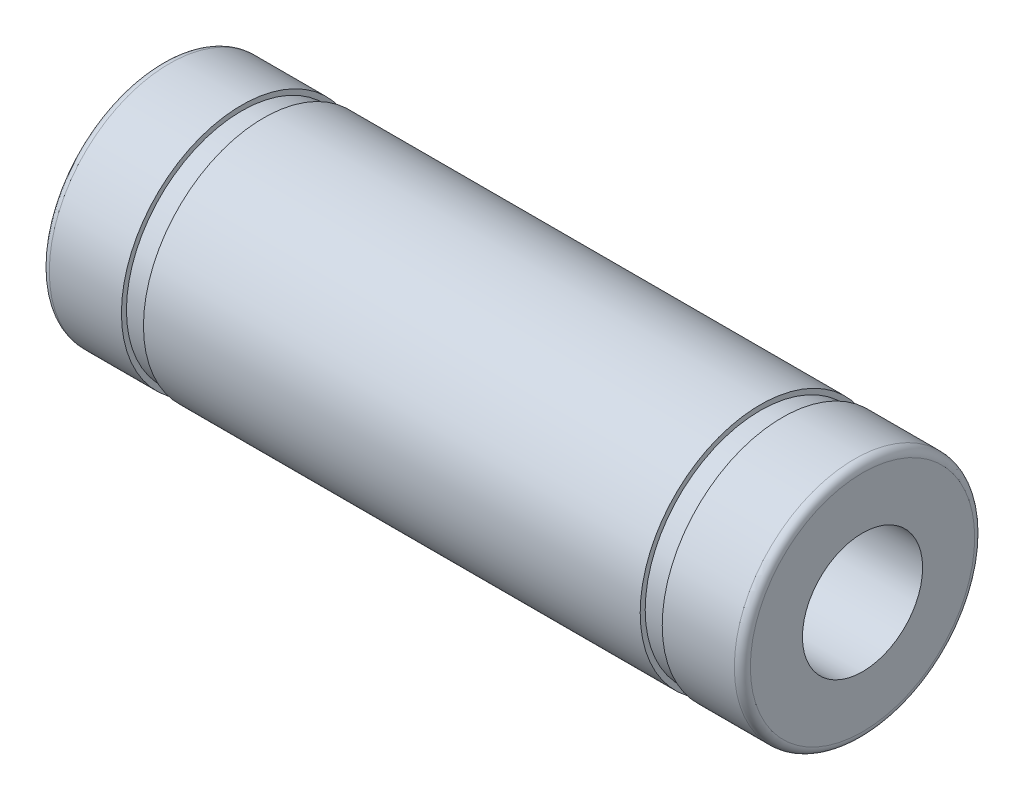
ISO-10303-21;
HEADER;
FILE_DESCRIPTION(('STEP AP214'),'2;1');
FILE_NAME('part.step','',(''),(''),'','','');
FILE_SCHEMA(('AUTOMOTIVE_DESIGN { 1 0 10303 214 1 1 1 1 }'));
ENDSEC;
DATA;
#1=APPLICATION_CONTEXT('core data for automotive mechanical design processes');
#2=APPLICATION_PROTOCOL_DEFINITION('international standard','automotive_design',2000,#1);
#3=PRODUCT_CONTEXT('',#1,'mechanical');
#4=PRODUCT('Part','Part','',(#3));
#5=PRODUCT_RELATED_PRODUCT_CATEGORY('part','',(#4));
#6=PRODUCT_DEFINITION_FORMATION('','',#4);
#7=PRODUCT_DEFINITION_CONTEXT('part definition',#1,'design');
#8=PRODUCT_DEFINITION('design','',#6,#7);
#9=PRODUCT_DEFINITION_SHAPE('','',#8);
#10=(LENGTH_UNIT() NAMED_UNIT(*) SI_UNIT(.MILLI.,.METRE.));
#11=(NAMED_UNIT(*) PLANE_ANGLE_UNIT() SI_UNIT($,.RADIAN.));
#12=(NAMED_UNIT(*) SI_UNIT($,.STERADIAN.) SOLID_ANGLE_UNIT());
#13=UNCERTAINTY_MEASURE_WITH_UNIT(LENGTH_MEASURE(1.E-05),#10,'distance_accuracy_value','');
#14=(GEOMETRIC_REPRESENTATION_CONTEXT(3) GLOBAL_UNCERTAINTY_ASSIGNED_CONTEXT((#13)) GLOBAL_UNIT_ASSIGNED_CONTEXT((#10,
#11,#12)) REPRESENTATION_CONTEXT('',''));
#15=CARTESIAN_POINT('',(0.,0.,0.));
#16=DIRECTION('',(0.,0.,1.));
#17=DIRECTION('',(1.,0.,0.));
#18=AXIS2_PLACEMENT_3D('',#15,#16,#17);
#19=CARTESIAN_POINT('',(0.,-5.6,-5.6));
#20=DIRECTION('',(-1.,0.,0.));
#21=DIRECTION('',(0.,0.,1.));
#22=AXIS2_PLACEMENT_3D('',#19,#20,#21);
#23=PLANE('',#22);
#24=CARTESIAN_POINT('',(0.,0.,0.));
#25=DIRECTION('',(-1.,0.,0.));
#26=DIRECTION('',(0.,0.,-1.));
#27=AXIS2_PLACEMENT_3D('',#24,#25,#26);
#28=CIRCLE('',#27,5.6);
#29=CARTESIAN_POINT('',(0.,0.,-5.6));
#30=VERTEX_POINT('',#29);
#31=EDGE_CURVE('E61',#30,#30,#28,.F.);
#32=ORIENTED_EDGE('',*,*,#31,.F.);
#33=EDGE_LOOP('',(#32));
#34=FACE_BOUND('',#33,.T.);
#35=CARTESIAN_POINT('',(0.,0.,0.));
#36=DIRECTION('',(1.,0.,0.));
#37=DIRECTION('',(0.,0.,1.));
#38=AXIS2_PLACEMENT_3D('',#35,#36,#37);
#39=CIRCLE('',#38,3.);
#40=CARTESIAN_POINT('',(0.,0.,3.));
#41=VERTEX_POINT('',#40);
#42=EDGE_CURVE('E58',#41,#41,#39,.T.);
#43=ORIENTED_EDGE('',*,*,#42,.T.);
#44=EDGE_LOOP('',(#43));
#45=FACE_BOUND('',#44,.T.);
#46=ADVANCED_FACE('F14',(#34,#45),#23,.T.);
#47=CARTESIAN_POINT('',(35.,-5.6,5.6));
#48=DIRECTION('',(1.,0.,0.));
#49=DIRECTION('',(0.,0.,-1.));
#50=AXIS2_PLACEMENT_3D('',#47,#48,#49);
#51=PLANE('',#50);
#52=CARTESIAN_POINT('',(35.,0.,0.));
#53=DIRECTION('',(1.,0.,0.));
#54=DIRECTION('',(0.,0.,1.));
#55=AXIS2_PLACEMENT_3D('',#52,#53,#54);
#56=CIRCLE('',#55,5.6);
#57=CARTESIAN_POINT('',(35.,0.,5.6));
#58=VERTEX_POINT('',#57);
#59=EDGE_CURVE('E55',#58,#58,#56,.T.);
#60=ORIENTED_EDGE('',*,*,#59,.T.);
#61=EDGE_LOOP('',(#60));
#62=FACE_BOUND('',#61,.T.);
#63=CARTESIAN_POINT('',(35.,0.,0.));
#64=DIRECTION('',(-1.,0.,0.));
#65=DIRECTION('',(0.,0.,-1.));
#66=AXIS2_PLACEMENT_3D('',#63,#64,#65);
#67=CIRCLE('',#66,3.);
#68=CARTESIAN_POINT('',(35.,0.,-3.));
#69=VERTEX_POINT('',#68);
#70=EDGE_CURVE('E52',#69,#69,#67,.F.);
#71=ORIENTED_EDGE('',*,*,#70,.F.);
#72=EDGE_LOOP('',(#71));
#73=FACE_BOUND('',#72,.T.);
#74=ADVANCED_FACE('F69',(#62,#73),#51,.T.);
#75=CARTESIAN_POINT('',(31.,-6.16394374595285,-6.));
#76=DIRECTION('',(-1.,0.,0.));
#77=DIRECTION('',(0.,0.,1.));
#78=AXIS2_PLACEMENT_3D('',#75,#76,#77);
#79=PLANE('',#78);
#80=CARTESIAN_POINT('',(31.,0.,0.));
#81=DIRECTION('',(-1.,0.,0.));
#82=DIRECTION('',(0.,0.,-1.));
#83=AXIS2_PLACEMENT_3D('',#80,#81,#82);
#84=CIRCLE('',#83,6.);
#85=CARTESIAN_POINT('',(31.,0.,-6.));
#86=VERTEX_POINT('',#85);
#87=EDGE_CURVE('E49',#86,#86,#84,.F.);
#88=ORIENTED_EDGE('',*,*,#87,.F.);
#89=EDGE_LOOP('',(#88));
#90=FACE_BOUND('',#89,.T.);
#91=CARTESIAN_POINT('',(31.,0.,0.));
#92=DIRECTION('',(1.,0.,0.));
#93=DIRECTION('',(0.,0.,1.));
#94=AXIS2_PLACEMENT_3D('',#91,#92,#93);
#95=CIRCLE('',#94,5.75);
#96=CARTESIAN_POINT('',(31.,0.,5.75));
#97=VERTEX_POINT('',#96);
#98=EDGE_CURVE('E46',#97,#97,#95,.T.);
#99=ORIENTED_EDGE('',*,*,#98,.T.);
#100=EDGE_LOOP('',(#99));
#101=FACE_BOUND('',#100,.T.);
#102=ADVANCED_FACE('F123',(#90,#101),#79,.T.);
#103=CARTESIAN_POINT('',(29.9,-6.16394374595285,6.));
#104=DIRECTION('',(1.,0.,0.));
#105=DIRECTION('',(0.,0.,-1.));
#106=AXIS2_PLACEMENT_3D('',#103,#104,#105);
#107=PLANE('',#106);
#108=CARTESIAN_POINT('',(29.9,0.,0.));
#109=DIRECTION('',(1.,0.,0.));
#110=DIRECTION('',(0.,0.,1.));
#111=AXIS2_PLACEMENT_3D('',#108,#109,#110);
#112=CIRCLE('',#111,6.);
#113=CARTESIAN_POINT('',(29.9,0.,6.));
#114=VERTEX_POINT('',#113);
#115=EDGE_CURVE('E43',#114,#114,#112,.T.);
#116=ORIENTED_EDGE('',*,*,#115,.T.);
#117=EDGE_LOOP('',(#116));
#118=FACE_BOUND('',#117,.T.);
#119=CARTESIAN_POINT('',(29.9,0.,0.));
#120=DIRECTION('',(-1.,0.,0.));
#121=DIRECTION('',(0.,0.,-1.));
#122=AXIS2_PLACEMENT_3D('',#119,#120,#121);
#123=CIRCLE('',#122,5.75);
#124=CARTESIAN_POINT('',(29.9,0.,-5.75));
#125=VERTEX_POINT('',#124);
#126=EDGE_CURVE('E40',#125,#125,#123,.F.);
#127=ORIENTED_EDGE('',*,*,#126,.F.);
#128=EDGE_LOOP('',(#127));
#129=FACE_BOUND('',#128,.T.);
#130=ADVANCED_FACE('F118',(#118,#129),#107,.T.);
#131=CARTESIAN_POINT('',(5.1,-6.16394374595285,-6.));
#132=DIRECTION('',(-1.,0.,0.));
#133=DIRECTION('',(0.,0.,1.));
#134=AXIS2_PLACEMENT_3D('',#131,#132,#133);
#135=PLANE('',#134);
#136=CARTESIAN_POINT('',(5.1,0.,0.));
#137=DIRECTION('',(-1.,0.,0.));
#138=DIRECTION('',(0.,0.,-1.));
#139=AXIS2_PLACEMENT_3D('',#136,#137,#138);
#140=CIRCLE('',#139,6.);
#141=CARTESIAN_POINT('',(5.1,0.,-6.));
#142=VERTEX_POINT('',#141);
#143=EDGE_CURVE('E37',#142,#142,#140,.F.);
#144=ORIENTED_EDGE('',*,*,#143,.F.);
#145=EDGE_LOOP('',(#144));
#146=FACE_BOUND('',#145,.T.);
#147=CARTESIAN_POINT('',(5.1,0.,0.));
#148=DIRECTION('',(1.,0.,0.));
#149=DIRECTION('',(0.,0.,1.));
#150=AXIS2_PLACEMENT_3D('',#147,#148,#149);
#151=CIRCLE('',#150,5.75);
#152=CARTESIAN_POINT('',(5.1,0.,5.75));
#153=VERTEX_POINT('',#152);
#154=EDGE_CURVE('E34',#153,#153,#151,.T.);
#155=ORIENTED_EDGE('',*,*,#154,.T.);
#156=EDGE_LOOP('',(#155));
#157=FACE_BOUND('',#156,.T.);
#158=ADVANCED_FACE('F86',(#146,#157),#135,.T.);
#159=CARTESIAN_POINT('',(4.,-6.16394374595285,6.));
#160=DIRECTION('',(1.,0.,0.));
#161=DIRECTION('',(0.,0.,-1.));
#162=AXIS2_PLACEMENT_3D('',#159,#160,#161);
#163=PLANE('',#162);
#164=CARTESIAN_POINT('',(4.,0.,0.));
#165=DIRECTION('',(1.,0.,0.));
#166=DIRECTION('',(0.,0.,1.));
#167=AXIS2_PLACEMENT_3D('',#164,#165,#166);
#168=CIRCLE('',#167,6.);
#169=CARTESIAN_POINT('',(4.,0.,6.));
#170=VERTEX_POINT('',#169);
#171=EDGE_CURVE('E29',#170,#170,#168,.T.);
#172=ORIENTED_EDGE('',*,*,#171,.T.);
#173=EDGE_LOOP('',(#172));
#174=FACE_BOUND('',#173,.T.);
#175=CARTESIAN_POINT('',(4.,0.,0.));
#176=DIRECTION('',(-1.,0.,0.));
#177=DIRECTION('',(0.,0.,-1.));
#178=AXIS2_PLACEMENT_3D('',#175,#176,#177);
#179=CIRCLE('',#178,5.75);
#180=CARTESIAN_POINT('',(4.,0.,-5.75));
#181=VERTEX_POINT('',#180);
#182=EDGE_CURVE('E25',#181,#181,#179,.F.);
#183=ORIENTED_EDGE('',*,*,#182,.F.);
#184=EDGE_LOOP('',(#183));
#185=FACE_BOUND('',#184,.T.);
#186=ADVANCED_FACE('F76',(#174,#185),#163,.T.);
#187=CARTESIAN_POINT('',(17.5,0.,0.));
#188=DIRECTION('',(1.,0.,0.));
#189=DIRECTION('',(0.,0.,1.));
#190=AXIS2_PLACEMENT_3D('',#187,#188,#189);
#191=CYLINDRICAL_SURFACE('',#190,3.);
#192=ORIENTED_EDGE('',*,*,#70,.T.);
#193=EDGE_LOOP('',(#192));
#194=FACE_BOUND('',#193,.T.);
#195=ORIENTED_EDGE('',*,*,#42,.F.);
#196=EDGE_LOOP('',(#195));
#197=FACE_BOUND('',#196,.T.);
#198=ADVANCED_FACE('F73',(#194,#197),#191,.F.);
#199=CARTESIAN_POINT('',(34.6000000000006,0.,0.));
#200=DIRECTION('',(1.,0.,0.));
#201=DIRECTION('',(0.,0.,1.));
#202=AXIS2_PLACEMENT_3D('',#199,#200,#201);
#203=TOROIDAL_SURFACE('',#202,5.60000000000061,0.399999999999387);
#204=CARTESIAN_POINT('',(34.6000000000006,0.,0.));
#205=DIRECTION('',(1.,0.,0.));
#206=DIRECTION('',(0.,0.,1.));
#207=AXIS2_PLACEMENT_3D('',#204,#205,#206);
#208=CIRCLE('',#207,6.);
#209=CARTESIAN_POINT('',(34.6000000000006,0.,6.));
#210=VERTEX_POINT('',#209);
#211=EDGE_CURVE('E21',#210,#210,#208,.T.);
#212=ORIENTED_EDGE('',*,*,#211,.T.);
#213=EDGE_LOOP('',(#212));
#214=FACE_BOUND('',#213,.T.);
#215=ORIENTED_EDGE('',*,*,#59,.F.);
#216=EDGE_LOOP('',(#215));
#217=FACE_BOUND('',#216,.T.);
#218=ADVANCED_FACE('F75',(#214,#217),#203,.T.);
#219=CARTESIAN_POINT('',(17.5,0.,0.));
#220=DIRECTION('',(1.,0.,0.));
#221=DIRECTION('',(0.,0.,1.));
#222=AXIS2_PLACEMENT_3D('',#219,#220,#221);
#223=CYLINDRICAL_SURFACE('',#222,6.);
#224=ORIENTED_EDGE('',*,*,#87,.T.);
#225=EDGE_LOOP('',(#224));
#226=FACE_BOUND('',#225,.T.);
#227=ORIENTED_EDGE('',*,*,#211,.F.);
#228=EDGE_LOOP('',(#227));
#229=FACE_BOUND('',#228,.T.);
#230=ADVANCED_FACE('F84',(#226,#229),#223,.T.);
#231=CARTESIAN_POINT('',(17.5,0.,0.));
#232=DIRECTION('',(1.,0.,0.));
#233=DIRECTION('',(0.,0.,1.));
#234=AXIS2_PLACEMENT_3D('',#231,#232,#233);
#235=CYLINDRICAL_SURFACE('',#234,5.75);
#236=ORIENTED_EDGE('',*,*,#126,.T.);
#237=EDGE_LOOP('',(#236));
#238=FACE_BOUND('',#237,.T.);
#239=ORIENTED_EDGE('',*,*,#98,.F.);
#240=EDGE_LOOP('',(#239));
#241=FACE_BOUND('',#240,.T.);
#242=ADVANCED_FACE('F93',(#238,#241),#235,.T.);
#243=CARTESIAN_POINT('',(17.5,0.,0.));
#244=DIRECTION('',(1.,0.,0.));
#245=DIRECTION('',(0.,0.,1.));
#246=AXIS2_PLACEMENT_3D('',#243,#244,#245);
#247=CYLINDRICAL_SURFACE('',#246,6.);
#248=ORIENTED_EDGE('',*,*,#143,.T.);
#249=EDGE_LOOP('',(#248));
#250=FACE_BOUND('',#249,.T.);
#251=ORIENTED_EDGE('',*,*,#115,.F.);
#252=EDGE_LOOP('',(#251));
#253=FACE_BOUND('',#252,.T.);
#254=ADVANCED_FACE('F97',(#250,#253),#247,.T.);
#255=CARTESIAN_POINT('',(17.5,0.,0.));
#256=DIRECTION('',(1.,0.,0.));
#257=DIRECTION('',(0.,0.,1.));
#258=AXIS2_PLACEMENT_3D('',#255,#256,#257);
#259=CYLINDRICAL_SURFACE('',#258,5.75);
#260=ORIENTED_EDGE('',*,*,#182,.T.);
#261=EDGE_LOOP('',(#260));
#262=FACE_BOUND('',#261,.T.);
#263=ORIENTED_EDGE('',*,*,#154,.F.);
#264=EDGE_LOOP('',(#263));
#265=FACE_BOUND('',#264,.T.);
#266=ADVANCED_FACE('F101',(#262,#265),#259,.T.);
#267=CARTESIAN_POINT('',(17.5,0.,0.));
#268=DIRECTION('',(1.,0.,0.));
#269=DIRECTION('',(0.,0.,1.));
#270=AXIS2_PLACEMENT_3D('',#267,#268,#269);
#271=CYLINDRICAL_SURFACE('',#270,6.);
#272=CARTESIAN_POINT('',(0.399999999999999,0.,0.));
#273=DIRECTION('',(1.,0.,0.));
#274=DIRECTION('',(0.,0.,1.));
#275=AXIS2_PLACEMENT_3D('',#272,#273,#274);
#276=CIRCLE('',#275,6.);
#277=CARTESIAN_POINT('',(0.399999999999999,0.,6.));
#278=VERTEX_POINT('',#277);
#279=EDGE_CURVE('E10',#278,#278,#276,.T.);
#280=ORIENTED_EDGE('',*,*,#279,.T.);
#281=EDGE_LOOP('',(#280));
#282=FACE_BOUND('',#281,.T.);
#283=ORIENTED_EDGE('',*,*,#171,.F.);
#284=EDGE_LOOP('',(#283));
#285=FACE_BOUND('',#284,.T.);
#286=ADVANCED_FACE('F104',(#282,#285),#271,.T.);
#287=CARTESIAN_POINT('',(0.40000000000003,0.,0.));
#288=DIRECTION('',(1.,0.,0.));
#289=DIRECTION('',(0.,0.,1.));
#290=AXIS2_PLACEMENT_3D('',#287,#288,#289);
#291=TOROIDAL_SURFACE('',#290,5.6,0.40000000000003);
#292=ORIENTED_EDGE('',*,*,#31,.T.);
#293=EDGE_LOOP('',(#292));
#294=FACE_BOUND('',#293,.T.);
#295=ORIENTED_EDGE('',*,*,#279,.F.);
#296=EDGE_LOOP('',(#295));
#297=FACE_BOUND('',#296,.T.);
#298=ADVANCED_FACE('F16',(#294,#297),#291,.T.);
#299=CLOSED_SHELL('',(#46,#74,#102,#130,#158,#186,#198,#218,#230,#242,#254,#266,#286,#298));
#300=MANIFOLD_SOLID_BREP('B1',#299);
#301=ADVANCED_BREP_SHAPE_REPRESENTATION('',(#18,#300),#14);
#302=SHAPE_DEFINITION_REPRESENTATION(#9,#301);
ENDSEC;
END-ISO-10303-21;
